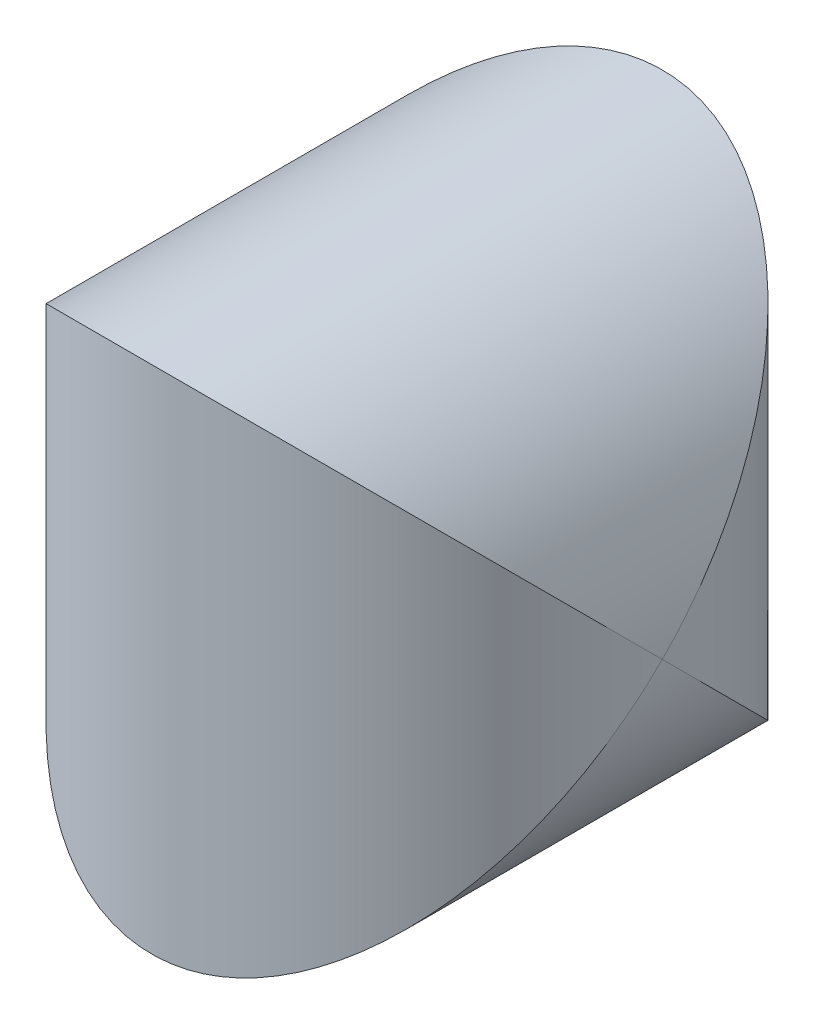
ISO-10303-21;
HEADER;
FILE_DESCRIPTION(('STEP AP214'),'2;1');
FILE_NAME('part.step','',(''),(''),'','','');
FILE_SCHEMA(('AUTOMOTIVE_DESIGN { 1 0 10303 214 1 1 1 1 }'));
ENDSEC;
DATA;
#1=APPLICATION_CONTEXT('core data for automotive mechanical design processes');
#2=APPLICATION_PROTOCOL_DEFINITION('international standard','automotive_design',2000,#1);
#3=PRODUCT_CONTEXT('',#1,'mechanical');
#4=PRODUCT('Part','Part','',(#3));
#5=PRODUCT_RELATED_PRODUCT_CATEGORY('part','',(#4));
#6=PRODUCT_DEFINITION_FORMATION('','',#4);
#7=PRODUCT_DEFINITION_CONTEXT('part definition',#1,'design');
#8=PRODUCT_DEFINITION('design','',#6,#7);
#9=PRODUCT_DEFINITION_SHAPE('','',#8);
#10=(LENGTH_UNIT() NAMED_UNIT(*) SI_UNIT(.MILLI.,.METRE.));
#11=(NAMED_UNIT(*) PLANE_ANGLE_UNIT() SI_UNIT($,.RADIAN.));
#12=(NAMED_UNIT(*) SI_UNIT($,.STERADIAN.) SOLID_ANGLE_UNIT());
#13=UNCERTAINTY_MEASURE_WITH_UNIT(LENGTH_MEASURE(1.E-05),#10,'distance_accuracy_value','');
#14=(GEOMETRIC_REPRESENTATION_CONTEXT(3) GLOBAL_UNCERTAINTY_ASSIGNED_CONTEXT((#13)) GLOBAL_UNIT_ASSIGNED_CONTEXT((#10,
#11,#12)) REPRESENTATION_CONTEXT('',''));
#15=CARTESIAN_POINT('',(0.,0.,0.));
#16=DIRECTION('',(0.,0.,1.));
#17=DIRECTION('',(1.,0.,0.));
#18=AXIS2_PLACEMENT_3D('',#15,#16,#17);
#19=CARTESIAN_POINT('',(0.,25.,0.));
#20=DIRECTION('',(0.,-1.,0.));
#21=DIRECTION('',(0.,0.,-1.));
#22=AXIS2_PLACEMENT_3D('',#19,#20,#21);
#23=CYLINDRICAL_SURFACE('',#22,25.);
#24=CARTESIAN_POINT('',(0.,0.,0.));
#25=DIRECTION('',(0.,-0.707106781186547,0.707106781186547));
#26=DIRECTION('',(0.,-0.707106781186547,-0.707106781186547));
#27=AXIS2_PLACEMENT_3D('',#24,#25,#26);
#28=ELLIPSE('',#27,35.3553390593274,25.);
#29=CARTESIAN_POINT('',(-25.,0.,0.));
#30=VERTEX_POINT('',#29);
#31=CARTESIAN_POINT('',(25.,0.,0.));
#32=VERTEX_POINT('',#31);
#33=EDGE_CURVE('E66',#30,#32,#28,.T.);
#34=ORIENTED_EDGE('',*,*,#33,.F.);
#35=CARTESIAN_POINT('',(0.,0.,0.));
#36=DIRECTION('',(0.,-0.707106781186547,-0.707106781186547));
#37=DIRECTION('',(0.,-0.707106781186547,0.707106781186547));
#38=AXIS2_PLACEMENT_3D('',#35,#36,#37);
#39=ELLIPSE('',#38,35.3553390593274,25.);
#40=EDGE_CURVE('E44',#32,#30,#39,.F.);
#41=ORIENTED_EDGE('',*,*,#40,.F.);
#42=EDGE_LOOP('',(#34,#41));
#43=FACE_BOUND('',#42,.T.);
#44=ADVANCED_FACE('F40',(#43),#23,.T.);
#45=CARTESIAN_POINT('',(0.,0.,-40.));
#46=DIRECTION('',(0.,0.,1.));
#47=DIRECTION('',(1.,0.,0.));
#48=AXIS2_PLACEMENT_3D('',#45,#46,#47);
#49=CYLINDRICAL_SURFACE('',#48,25.);
#50=ORIENTED_EDGE('',*,*,#40,.T.);
#51=CARTESIAN_POINT('',(0.,0.,0.));
#52=DIRECTION('',(0.,-0.707106781186547,0.707106781186547));
#53=DIRECTION('',(0.,-0.707106781186547,-0.707106781186547));
#54=AXIS2_PLACEMENT_3D('',#51,#52,#53);
#55=ELLIPSE('',#54,35.3553390593274,25.);
#56=EDGE_CURVE('E56',#30,#32,#55,.F.);
#57=ORIENTED_EDGE('',*,*,#56,.T.);
#58=EDGE_LOOP('',(#50,#57));
#59=FACE_BOUND('',#58,.T.);
#60=ADVANCED_FACE('F59',(#59),#49,.T.);
#61=ORIENTED_EDGE('',*,*,#56,.F.);
#62=CARTESIAN_POINT('',(0.,0.,0.));
#63=DIRECTION('',(0.,-0.707106781186547,-0.707106781186547));
#64=DIRECTION('',(0.,-0.707106781186547,0.707106781186547));
#65=AXIS2_PLACEMENT_3D('',#62,#63,#64);
#66=ELLIPSE('',#65,35.3553390593274,25.);
#67=EDGE_CURVE('E12',#32,#30,#66,.T.);
#68=ORIENTED_EDGE('',*,*,#67,.F.);
#69=EDGE_LOOP('',(#61,#68));
#70=FACE_BOUND('',#69,.T.);
#71=ADVANCED_FACE('F42',(#70),#23,.T.);
#72=ORIENTED_EDGE('',*,*,#67,.T.);
#73=ORIENTED_EDGE('',*,*,#33,.T.);
#74=EDGE_LOOP('',(#72,#73));
#75=FACE_BOUND('',#74,.T.);
#76=ADVANCED_FACE('F70',(#75),#49,.T.);
#77=CLOSED_SHELL('',(#44,#60,#71,#76));
#78=MANIFOLD_SOLID_BREP('B2',#77);
#79=ADVANCED_BREP_SHAPE_REPRESENTATION('',(#18,#78),#14);
#80=SHAPE_DEFINITION_REPRESENTATION(#9,#79);
ENDSEC;
END-ISO-10303-21;
